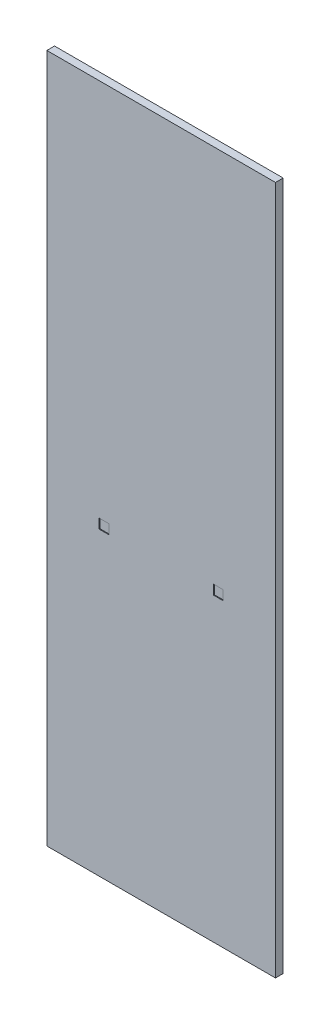
ISO-10303-21;
HEADER;
FILE_DESCRIPTION(('STEP AP214'),'2;1');
FILE_NAME('part.step','',(''),(''),'','','');
FILE_SCHEMA(('AUTOMOTIVE_DESIGN { 1 0 10303 214 1 1 1 1 }'));
ENDSEC;
DATA;
#1=APPLICATION_CONTEXT('core data for automotive mechanical design processes');
#2=APPLICATION_PROTOCOL_DEFINITION('international standard','automotive_design',2000,#1);
#3=PRODUCT_CONTEXT('',#1,'mechanical');
#4=PRODUCT('Part','Part','',(#3));
#5=PRODUCT_RELATED_PRODUCT_CATEGORY('part','',(#4));
#6=PRODUCT_DEFINITION_FORMATION('','',#4);
#7=PRODUCT_DEFINITION_CONTEXT('part definition',#1,'design');
#8=PRODUCT_DEFINITION('design','',#6,#7);
#9=PRODUCT_DEFINITION_SHAPE('','',#8);
#10=(LENGTH_UNIT() NAMED_UNIT(*) SI_UNIT(.MILLI.,.METRE.));
#11=(NAMED_UNIT(*) PLANE_ANGLE_UNIT() SI_UNIT($,.RADIAN.));
#12=(NAMED_UNIT(*) SI_UNIT($,.STERADIAN.) SOLID_ANGLE_UNIT());
#13=UNCERTAINTY_MEASURE_WITH_UNIT(LENGTH_MEASURE(1.E-05),#10,'distance_accuracy_value','');
#14=(GEOMETRIC_REPRESENTATION_CONTEXT(3) GLOBAL_UNCERTAINTY_ASSIGNED_CONTEXT((#13)) GLOBAL_UNIT_ASSIGNED_CONTEXT((#10,
#11,#12)) REPRESENTATION_CONTEXT('',''));
#15=CARTESIAN_POINT('',(0.,0.,0.));
#16=DIRECTION('',(0.,0.,1.));
#17=DIRECTION('',(1.,0.,0.));
#18=AXIS2_PLACEMENT_3D('',#15,#16,#17);
#19=CARTESIAN_POINT('',(-298.,-898.,20.));
#20=DIRECTION('',(1.,0.,0.));
#21=DIRECTION('',(0.,0.,-1.));
#22=AXIS2_PLACEMENT_3D('',#19,#20,#21);
#23=PLANE('',#22);
#24=DIRECTION('',(0.,-1.,0.));
#25=VECTOR('',#24,1.);
#26=CARTESIAN_POINT('',(-298.,-898.,0.));
#27=LINE('',#26,#25);
#28=CARTESIAN_POINT('',(-298.,898.,0.));
#29=VERTEX_POINT('',#28);
#30=CARTESIAN_POINT('',(-298.,-898.,0.));
#31=VERTEX_POINT('',#30);
#32=EDGE_CURVE('E156',#29,#31,#27,.T.);
#33=ORIENTED_EDGE('',*,*,#32,.T.);
#34=DIRECTION('',(0.,0.,-1.));
#35=VECTOR('',#34,1.);
#36=CARTESIAN_POINT('',(-298.,-898.,20.));
#37=LINE('',#36,#35);
#38=CARTESIAN_POINT('',(-298.,-898.,20.));
#39=VERTEX_POINT('',#38);
#40=EDGE_CURVE('E11',#39,#31,#37,.T.);
#41=ORIENTED_EDGE('',*,*,#40,.F.);
#42=DIRECTION('',(0.,-1.,0.));
#43=VECTOR('',#42,1.);
#44=CARTESIAN_POINT('',(-298.,-898.,20.));
#45=LINE('',#44,#43);
#46=CARTESIAN_POINT('',(-298.,898.,20.));
#47=VERTEX_POINT('',#46);
#48=EDGE_CURVE('E189',#47,#39,#45,.T.);
#49=ORIENTED_EDGE('',*,*,#48,.F.);
#50=DIRECTION('',(0.,0.,-1.));
#51=VECTOR('',#50,1.);
#52=CARTESIAN_POINT('',(-298.,898.,20.));
#53=LINE('',#52,#51);
#54=EDGE_CURVE('E199',#47,#29,#53,.T.);
#55=ORIENTED_EDGE('',*,*,#54,.T.);
#56=EDGE_LOOP('',(#33,#41,#49,#55));
#57=FACE_BOUND('',#56,.T.);
#58=ADVANCED_FACE('F32',(#57),#23,.F.);
#59=CARTESIAN_POINT('',(298.,-898.,20.));
#60=DIRECTION('',(0.,1.,0.));
#61=DIRECTION('',(0.,0.,1.));
#62=AXIS2_PLACEMENT_3D('',#59,#60,#61);
#63=PLANE('',#62);
#64=DIRECTION('',(1.,0.,0.));
#65=VECTOR('',#64,1.);
#66=CARTESIAN_POINT('',(298.,-898.,0.));
#67=LINE('',#66,#65);
#68=CARTESIAN_POINT('',(298.,-898.,0.));
#69=VERTEX_POINT('',#68);
#70=EDGE_CURVE('E202',#31,#69,#67,.T.);
#71=ORIENTED_EDGE('',*,*,#70,.T.);
#72=DIRECTION('',(0.,0.,-1.));
#73=VECTOR('',#72,1.);
#74=CARTESIAN_POINT('',(298.,-898.,20.));
#75=LINE('',#74,#73);
#76=CARTESIAN_POINT('',(298.,-898.,20.));
#77=VERTEX_POINT('',#76);
#78=EDGE_CURVE('E39',#77,#69,#75,.T.);
#79=ORIENTED_EDGE('',*,*,#78,.F.);
#80=DIRECTION('',(1.,0.,0.));
#81=VECTOR('',#80,1.);
#82=CARTESIAN_POINT('',(298.,-898.,20.));
#83=LINE('',#82,#81);
#84=EDGE_CURVE('E192',#39,#77,#83,.T.);
#85=ORIENTED_EDGE('',*,*,#84,.F.);
#86=ORIENTED_EDGE('',*,*,#40,.T.);
#87=EDGE_LOOP('',(#71,#79,#85,#86));
#88=FACE_BOUND('',#87,.T.);
#89=ADVANCED_FACE('F232',(#88),#63,.F.);
#90=CARTESIAN_POINT('',(298.,-898.,20.));
#91=DIRECTION('',(-1.,0.,0.));
#92=DIRECTION('',(0.,0.,1.));
#93=AXIS2_PLACEMENT_3D('',#90,#91,#92);
#94=PLANE('',#93);
#95=DIRECTION('',(0.,1.,0.));
#96=VECTOR('',#95,1.);
#97=CARTESIAN_POINT('',(298.,-898.,0.));
#98=LINE('',#97,#96);
#99=CARTESIAN_POINT('',(298.,898.,0.));
#100=VERTEX_POINT('',#99);
#101=EDGE_CURVE('E204',#69,#100,#98,.T.);
#102=ORIENTED_EDGE('',*,*,#101,.T.);
#103=DIRECTION('',(0.,0.,-1.));
#104=VECTOR('',#103,1.);
#105=CARTESIAN_POINT('',(298.,898.,20.));
#106=LINE('',#105,#104);
#107=CARTESIAN_POINT('',(298.,898.,20.));
#108=VERTEX_POINT('',#107);
#109=EDGE_CURVE('E209',#108,#100,#106,.T.);
#110=ORIENTED_EDGE('',*,*,#109,.F.);
#111=DIRECTION('',(0.,1.,0.));
#112=VECTOR('',#111,1.);
#113=CARTESIAN_POINT('',(298.,-898.,20.));
#114=LINE('',#113,#112);
#115=EDGE_CURVE('E195',#77,#108,#114,.T.);
#116=ORIENTED_EDGE('',*,*,#115,.F.);
#117=ORIENTED_EDGE('',*,*,#78,.T.);
#118=EDGE_LOOP('',(#102,#110,#116,#117));
#119=FACE_BOUND('',#118,.T.);
#120=ADVANCED_FACE('F216',(#119),#94,.F.);
#121=CARTESIAN_POINT('',(298.,898.,20.));
#122=DIRECTION('',(0.,-1.,0.));
#123=DIRECTION('',(0.,0.,-1.));
#124=AXIS2_PLACEMENT_3D('',#121,#122,#123);
#125=PLANE('',#124);
#126=DIRECTION('',(-1.,0.,0.));
#127=VECTOR('',#126,1.);
#128=CARTESIAN_POINT('',(298.,898.,0.));
#129=LINE('',#128,#127);
#130=EDGE_CURVE('E193',#100,#29,#129,.T.);
#131=ORIENTED_EDGE('',*,*,#130,.T.);
#132=ORIENTED_EDGE('',*,*,#54,.F.);
#133=DIRECTION('',(-1.,0.,0.));
#134=VECTOR('',#133,1.);
#135=CARTESIAN_POINT('',(298.,898.,20.));
#136=LINE('',#135,#134);
#137=EDGE_CURVE('E197',#108,#47,#136,.T.);
#138=ORIENTED_EDGE('',*,*,#137,.F.);
#139=ORIENTED_EDGE('',*,*,#109,.T.);
#140=EDGE_LOOP('',(#131,#132,#138,#139));
#141=FACE_BOUND('',#140,.T.);
#142=ADVANCED_FACE('F225',(#141),#125,.F.);
#143=CARTESIAN_POINT('',(0.,0.,20.));
#144=DIRECTION('',(0.,0.,1.));
#145=DIRECTION('',(1.,0.,0.));
#146=AXIS2_PLACEMENT_3D('',#143,#144,#145);
#147=PLANE('',#146);
#148=DIRECTION('',(0.,-1.,0.));
#149=VECTOR('',#148,1.);
#150=CARTESIAN_POINT('',(-161.5,-114.5,20.));
#151=LINE('',#150,#149);
#152=CARTESIAN_POINT('',(-161.5,-89.5000000000001,20.));
#153=VERTEX_POINT('',#152);
#154=CARTESIAN_POINT('',(-161.5,-114.5,20.));
#155=VERTEX_POINT('',#154);
#156=EDGE_CURVE('E46',#153,#155,#151,.T.);
#157=ORIENTED_EDGE('',*,*,#156,.F.);
#158=DIRECTION('',(-1.,0.,0.));
#159=VECTOR('',#158,1.);
#160=CARTESIAN_POINT('',(-136.5,-89.5000000000001,20.));
#161=LINE('',#160,#159);
#162=CARTESIAN_POINT('',(-136.5,-89.5000000000001,20.));
#163=VERTEX_POINT('',#162);
#164=EDGE_CURVE('E140',#163,#153,#161,.T.);
#165=ORIENTED_EDGE('',*,*,#164,.F.);
#166=DIRECTION('',(0.,1.,0.));
#167=VECTOR('',#166,1.);
#168=CARTESIAN_POINT('',(-136.5,-114.5,20.));
#169=LINE('',#168,#167);
#170=CARTESIAN_POINT('',(-136.5,-114.5,20.));
#171=VERTEX_POINT('',#170);
#172=EDGE_CURVE('E143',#171,#163,#169,.T.);
#173=ORIENTED_EDGE('',*,*,#172,.F.);
#174=DIRECTION('',(1.,0.,0.));
#175=VECTOR('',#174,1.);
#176=CARTESIAN_POINT('',(-136.5,-114.5,20.));
#177=LINE('',#176,#175);
#178=EDGE_CURVE('E149',#155,#171,#177,.T.);
#179=ORIENTED_EDGE('',*,*,#178,.F.);
#180=EDGE_LOOP('',(#157,#165,#173,#179));
#181=FACE_BOUND('',#180,.T.);
#182=DIRECTION('',(0.,-1.,0.));
#183=VECTOR('',#182,1.);
#184=CARTESIAN_POINT('',(136.5,-114.5,20.));
#185=LINE('',#184,#183);
#186=CARTESIAN_POINT('',(136.5,-89.5000000000001,20.));
#187=VERTEX_POINT('',#186);
#188=CARTESIAN_POINT('',(136.5,-114.5,20.));
#189=VERTEX_POINT('',#188);
#190=EDGE_CURVE('E54',#187,#189,#185,.T.);
#191=ORIENTED_EDGE('',*,*,#190,.F.);
#192=DIRECTION('',(-1.,0.,0.));
#193=VECTOR('',#192,1.);
#194=CARTESIAN_POINT('',(161.5,-89.5000000000001,20.));
#195=LINE('',#194,#193);
#196=CARTESIAN_POINT('',(161.5,-89.5000000000001,20.));
#197=VERTEX_POINT('',#196);
#198=EDGE_CURVE('E164',#197,#187,#195,.T.);
#199=ORIENTED_EDGE('',*,*,#198,.F.);
#200=DIRECTION('',(0.,1.,0.));
#201=VECTOR('',#200,1.);
#202=CARTESIAN_POINT('',(161.5,-114.5,20.));
#203=LINE('',#202,#201);
#204=CARTESIAN_POINT('',(161.5,-114.5,20.));
#205=VERTEX_POINT('',#204);
#206=EDGE_CURVE('E178',#205,#197,#203,.T.);
#207=ORIENTED_EDGE('',*,*,#206,.F.);
#208=DIRECTION('',(1.,0.,0.));
#209=VECTOR('',#208,1.);
#210=CARTESIAN_POINT('',(161.5,-114.5,20.));
#211=LINE('',#210,#209);
#212=EDGE_CURVE('E175',#189,#205,#211,.T.);
#213=ORIENTED_EDGE('',*,*,#212,.F.);
#214=EDGE_LOOP('',(#191,#199,#207,#213));
#215=FACE_BOUND('',#214,.T.);
#216=ORIENTED_EDGE('',*,*,#48,.T.);
#217=ORIENTED_EDGE('',*,*,#84,.T.);
#218=ORIENTED_EDGE('',*,*,#115,.T.);
#219=ORIENTED_EDGE('',*,*,#137,.T.);
#220=EDGE_LOOP('',(#216,#217,#218,#219));
#221=FACE_BOUND('',#220,.T.);
#222=ADVANCED_FACE('F231',(#181,#215,#221),#147,.T.);
#223=CARTESIAN_POINT('',(0.,0.,0.));
#224=DIRECTION('',(0.,0.,1.));
#225=DIRECTION('',(1.,0.,0.));
#226=AXIS2_PLACEMENT_3D('',#223,#224,#225);
#227=PLANE('',#226);
#228=ORIENTED_EDGE('',*,*,#32,.F.);
#229=ORIENTED_EDGE('',*,*,#130,.F.);
#230=ORIENTED_EDGE('',*,*,#101,.F.);
#231=ORIENTED_EDGE('',*,*,#70,.F.);
#232=EDGE_LOOP('',(#228,#229,#230,#231));
#233=FACE_BOUND('',#232,.T.);
#234=ADVANCED_FACE('F222',(#233),#227,.F.);
#235=CARTESIAN_POINT('',(136.5,-114.5,18.));
#236=DIRECTION('',(-1.,0.,0.));
#237=DIRECTION('',(0.,0.,1.));
#238=AXIS2_PLACEMENT_3D('',#235,#236,#237);
#239=PLANE('',#238);
#240=ORIENTED_EDGE('',*,*,#190,.T.);
#241=DIRECTION('',(0.,0.,1.));
#242=VECTOR('',#241,1.);
#243=CARTESIAN_POINT('',(136.5,-114.5,18.));
#244=LINE('',#243,#242);
#245=CARTESIAN_POINT('',(136.5,-114.5,18.));
#246=VERTEX_POINT('',#245);
#247=EDGE_CURVE('E173',#246,#189,#244,.T.);
#248=ORIENTED_EDGE('',*,*,#247,.F.);
#249=DIRECTION('',(0.,-1.,0.));
#250=VECTOR('',#249,1.);
#251=CARTESIAN_POINT('',(136.5,-114.5,18.));
#252=LINE('',#251,#250);
#253=CARTESIAN_POINT('',(136.5,-89.5000000000001,18.));
#254=VERTEX_POINT('',#253);
#255=EDGE_CURVE('E160',#254,#246,#252,.T.);
#256=ORIENTED_EDGE('',*,*,#255,.F.);
#257=DIRECTION('',(0.,0.,1.));
#258=VECTOR('',#257,1.);
#259=CARTESIAN_POINT('',(136.5,-89.5000000000001,18.));
#260=LINE('',#259,#258);
#261=EDGE_CURVE('E150',#254,#187,#260,.T.);
#262=ORIENTED_EDGE('',*,*,#261,.T.);
#263=EDGE_LOOP('',(#240,#248,#256,#262));
#264=FACE_BOUND('',#263,.T.);
#265=ADVANCED_FACE('F244',(#264),#239,.F.);
#266=CARTESIAN_POINT('',(161.5,-89.5000000000001,18.));
#267=DIRECTION('',(0.,1.,0.));
#268=DIRECTION('',(0.,0.,1.));
#269=AXIS2_PLACEMENT_3D('',#266,#267,#268);
#270=PLANE('',#269);
#271=ORIENTED_EDGE('',*,*,#198,.T.);
#272=ORIENTED_EDGE('',*,*,#261,.F.);
#273=DIRECTION('',(-1.,0.,0.));
#274=VECTOR('',#273,1.);
#275=CARTESIAN_POINT('',(161.5,-89.5000000000001,18.));
#276=LINE('',#275,#274);
#277=CARTESIAN_POINT('',(161.5,-89.5000000000001,18.));
#278=VERTEX_POINT('',#277);
#279=EDGE_CURVE('E170',#278,#254,#276,.T.);
#280=ORIENTED_EDGE('',*,*,#279,.F.);
#281=DIRECTION('',(0.,0.,1.));
#282=VECTOR('',#281,1.);
#283=CARTESIAN_POINT('',(161.5,-89.5000000000001,18.));
#284=LINE('',#283,#282);
#285=EDGE_CURVE('E184',#278,#197,#284,.T.);
#286=ORIENTED_EDGE('',*,*,#285,.T.);
#287=EDGE_LOOP('',(#271,#272,#280,#286));
#288=FACE_BOUND('',#287,.T.);
#289=ADVANCED_FACE('F250',(#288),#270,.F.);
#290=CARTESIAN_POINT('',(161.5,-114.5,18.));
#291=DIRECTION('',(1.,0.,0.));
#292=DIRECTION('',(0.,0.,-1.));
#293=AXIS2_PLACEMENT_3D('',#290,#291,#292);
#294=PLANE('',#293);
#295=ORIENTED_EDGE('',*,*,#206,.T.);
#296=ORIENTED_EDGE('',*,*,#285,.F.);
#297=DIRECTION('',(0.,1.,0.));
#298=VECTOR('',#297,1.);
#299=CARTESIAN_POINT('',(161.5,-114.5,18.));
#300=LINE('',#299,#298);
#301=CARTESIAN_POINT('',(161.5,-114.5,18.));
#302=VERTEX_POINT('',#301);
#303=EDGE_CURVE('E167',#302,#278,#300,.T.);
#304=ORIENTED_EDGE('',*,*,#303,.F.);
#305=DIRECTION('',(0.,0.,1.));
#306=VECTOR('',#305,1.);
#307=CARTESIAN_POINT('',(161.5,-114.5,18.));
#308=LINE('',#307,#306);
#309=EDGE_CURVE('E186',#302,#205,#308,.T.);
#310=ORIENTED_EDGE('',*,*,#309,.T.);
#311=EDGE_LOOP('',(#295,#296,#304,#310));
#312=FACE_BOUND('',#311,.T.);
#313=ADVANCED_FACE('F255',(#312),#294,.F.);
#314=CARTESIAN_POINT('',(161.5,-114.5,18.));
#315=DIRECTION('',(0.,-1.,0.));
#316=DIRECTION('',(0.,0.,-1.));
#317=AXIS2_PLACEMENT_3D('',#314,#315,#316);
#318=PLANE('',#317);
#319=ORIENTED_EDGE('',*,*,#212,.T.);
#320=ORIENTED_EDGE('',*,*,#309,.F.);
#321=DIRECTION('',(1.,0.,0.));
#322=VECTOR('',#321,1.);
#323=CARTESIAN_POINT('',(161.5,-114.5,18.));
#324=LINE('',#323,#322);
#325=EDGE_CURVE('E163',#246,#302,#324,.T.);
#326=ORIENTED_EDGE('',*,*,#325,.F.);
#327=ORIENTED_EDGE('',*,*,#247,.T.);
#328=EDGE_LOOP('',(#319,#320,#326,#327));
#329=FACE_BOUND('',#328,.T.);
#330=ADVANCED_FACE('F251',(#329),#318,.F.);
#331=CARTESIAN_POINT('',(0.,0.,18.));
#332=DIRECTION('',(0.,0.,1.));
#333=DIRECTION('',(1.,0.,0.));
#334=AXIS2_PLACEMENT_3D('',#331,#332,#333);
#335=PLANE('',#334);
#336=ORIENTED_EDGE('',*,*,#255,.T.);
#337=ORIENTED_EDGE('',*,*,#325,.T.);
#338=ORIENTED_EDGE('',*,*,#303,.T.);
#339=ORIENTED_EDGE('',*,*,#279,.T.);
#340=EDGE_LOOP('',(#336,#337,#338,#339));
#341=FACE_BOUND('',#340,.T.);
#342=ADVANCED_FACE('F254',(#341),#335,.T.);
#343=CARTESIAN_POINT('',(-161.5,-114.5,18.));
#344=DIRECTION('',(-1.,0.,0.));
#345=DIRECTION('',(0.,0.,1.));
#346=AXIS2_PLACEMENT_3D('',#343,#344,#345);
#347=PLANE('',#346);
#348=ORIENTED_EDGE('',*,*,#156,.T.);
#349=DIRECTION('',(0.,0.,1.));
#350=VECTOR('',#349,1.);
#351=CARTESIAN_POINT('',(-161.5,-114.5,18.));
#352=LINE('',#351,#350);
#353=CARTESIAN_POINT('',(-161.5,-114.5,18.));
#354=VERTEX_POINT('',#353);
#355=EDGE_CURVE('E118',#354,#155,#352,.T.);
#356=ORIENTED_EDGE('',*,*,#355,.F.);
#357=DIRECTION('',(0.,-1.,0.));
#358=VECTOR('',#357,1.);
#359=CARTESIAN_POINT('',(-161.5,-114.5,18.));
#360=LINE('',#359,#358);
#361=CARTESIAN_POINT('',(-161.5,-89.5000000000001,18.));
#362=VERTEX_POINT('',#361);
#363=EDGE_CURVE('E122',#362,#354,#360,.T.);
#364=ORIENTED_EDGE('',*,*,#363,.F.);
#365=DIRECTION('',(0.,0.,1.));
#366=VECTOR('',#365,1.);
#367=CARTESIAN_POINT('',(-161.5,-89.5000000000001,18.));
#368=LINE('',#367,#366);
#369=EDGE_CURVE('E154',#362,#153,#368,.T.);
#370=ORIENTED_EDGE('',*,*,#369,.T.);
#371=EDGE_LOOP('',(#348,#356,#364,#370));
#372=FACE_BOUND('',#371,.T.);
#373=ADVANCED_FACE('F120',(#372),#347,.F.);
#374=CARTESIAN_POINT('',(-136.5,-89.5000000000001,18.));
#375=DIRECTION('',(0.,1.,0.));
#376=DIRECTION('',(0.,0.,1.));
#377=AXIS2_PLACEMENT_3D('',#374,#375,#376);
#378=PLANE('',#377);
#379=ORIENTED_EDGE('',*,*,#164,.T.);
#380=ORIENTED_EDGE('',*,*,#369,.F.);
#381=DIRECTION('',(-1.,0.,0.));
#382=VECTOR('',#381,1.);
#383=CARTESIAN_POINT('',(-136.5,-89.5000000000001,18.));
#384=LINE('',#383,#382);
#385=CARTESIAN_POINT('',(-136.5,-89.5000000000001,18.));
#386=VERTEX_POINT('',#385);
#387=EDGE_CURVE('E128',#386,#362,#384,.T.);
#388=ORIENTED_EDGE('',*,*,#387,.F.);
#389=DIRECTION('',(0.,0.,1.));
#390=VECTOR('',#389,1.);
#391=CARTESIAN_POINT('',(-136.5,-89.5000000000001,18.));
#392=LINE('',#391,#390);
#393=EDGE_CURVE('E157',#386,#163,#392,.T.);
#394=ORIENTED_EDGE('',*,*,#393,.T.);
#395=EDGE_LOOP('',(#379,#380,#388,#394));
#396=FACE_BOUND('',#395,.T.);
#397=ADVANCED_FACE('F268',(#396),#378,.F.);
#398=CARTESIAN_POINT('',(-136.5,-114.5,18.));
#399=DIRECTION('',(1.,0.,0.));
#400=DIRECTION('',(0.,0.,-1.));
#401=AXIS2_PLACEMENT_3D('',#398,#399,#400);
#402=PLANE('',#401);
#403=ORIENTED_EDGE('',*,*,#172,.T.);
#404=ORIENTED_EDGE('',*,*,#393,.F.);
#405=DIRECTION('',(0.,1.,0.));
#406=VECTOR('',#405,1.);
#407=CARTESIAN_POINT('',(-136.5,-114.5,18.));
#408=LINE('',#407,#406);
#409=CARTESIAN_POINT('',(-136.5,-114.5,18.));
#410=VERTEX_POINT('',#409);
#411=EDGE_CURVE('E136',#410,#386,#408,.T.);
#412=ORIENTED_EDGE('',*,*,#411,.F.);
#413=DIRECTION('',(0.,0.,1.));
#414=VECTOR('',#413,1.);
#415=CARTESIAN_POINT('',(-136.5,-114.5,18.));
#416=LINE('',#415,#414);
#417=EDGE_CURVE('E127',#410,#171,#416,.T.);
#418=ORIENTED_EDGE('',*,*,#417,.T.);
#419=EDGE_LOOP('',(#403,#404,#412,#418));
#420=FACE_BOUND('',#419,.T.);
#421=ADVANCED_FACE('F271',(#420),#402,.F.);
#422=CARTESIAN_POINT('',(-136.5,-114.5,18.));
#423=DIRECTION('',(0.,-1.,0.));
#424=DIRECTION('',(0.,0.,-1.));
#425=AXIS2_PLACEMENT_3D('',#422,#423,#424);
#426=PLANE('',#425);
#427=ORIENTED_EDGE('',*,*,#178,.T.);
#428=ORIENTED_EDGE('',*,*,#417,.F.);
#429=DIRECTION('',(1.,0.,0.));
#430=VECTOR('',#429,1.);
#431=CARTESIAN_POINT('',(-136.5,-114.5,18.));
#432=LINE('',#431,#430);
#433=EDGE_CURVE('E131',#354,#410,#432,.T.);
#434=ORIENTED_EDGE('',*,*,#433,.F.);
#435=ORIENTED_EDGE('',*,*,#355,.T.);
#436=EDGE_LOOP('',(#427,#428,#434,#435));
#437=FACE_BOUND('',#436,.T.);
#438=ADVANCED_FACE('F132',(#437),#426,.F.);
#439=CARTESIAN_POINT('',(0.,0.,18.));
#440=DIRECTION('',(0.,0.,1.));
#441=DIRECTION('',(1.,0.,0.));
#442=AXIS2_PLACEMENT_3D('',#439,#440,#441);
#443=PLANE('',#442);
#444=ORIENTED_EDGE('',*,*,#363,.T.);
#445=ORIENTED_EDGE('',*,*,#433,.T.);
#446=ORIENTED_EDGE('',*,*,#411,.T.);
#447=ORIENTED_EDGE('',*,*,#387,.T.);
#448=EDGE_LOOP('',(#444,#445,#446,#447));
#449=FACE_BOUND('',#448,.T.);
#450=ADVANCED_FACE('F138',(#449),#443,.T.);
#451=CLOSED_SHELL('',(#58,#89,#120,#142,#222,#234,#265,#289,#313,#330,#342,#373,#397,#421,#438,#450));
#452=MANIFOLD_SOLID_BREP('B2',#451);
#453=ADVANCED_BREP_SHAPE_REPRESENTATION('',(#18,#452),#14);
#454=SHAPE_DEFINITION_REPRESENTATION(#9,#453);
ENDSEC;
END-ISO-10303-21;
